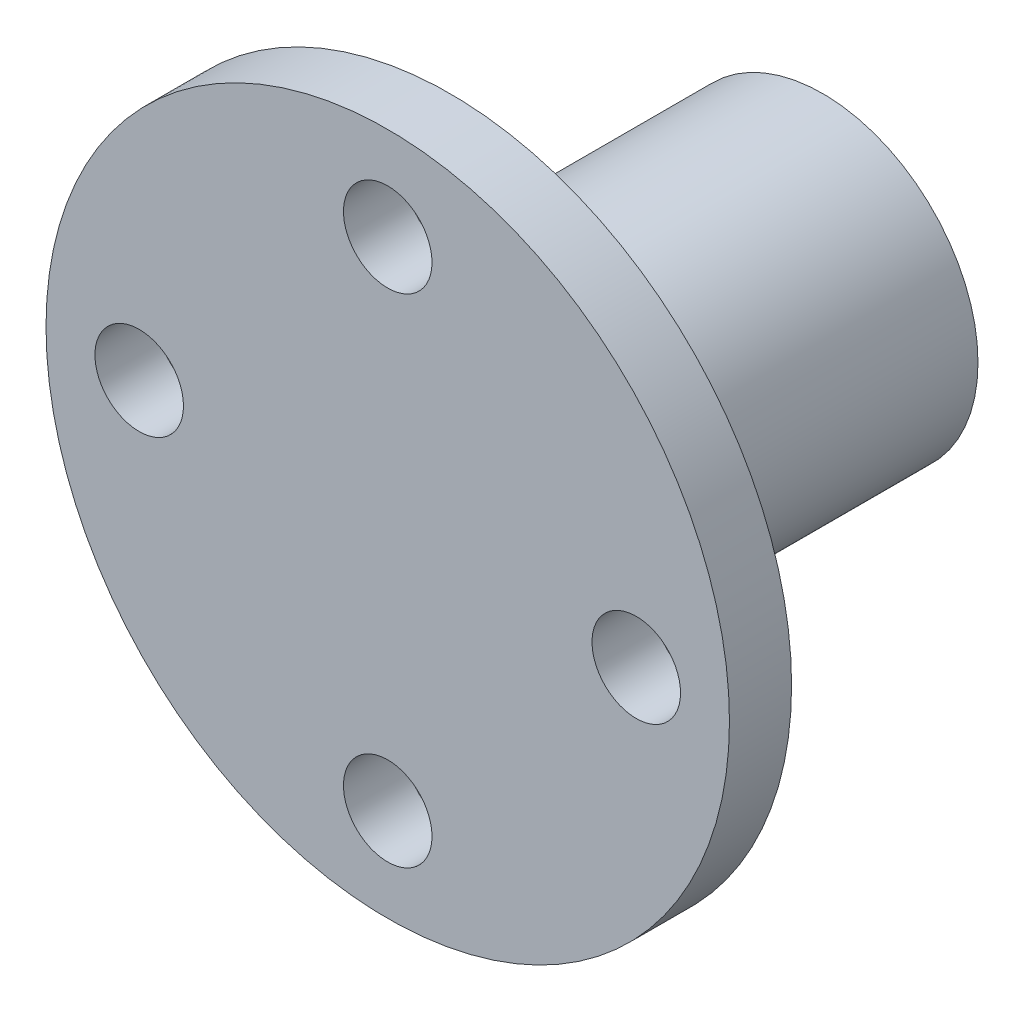
ISO-10303-21;
HEADER;
FILE_DESCRIPTION(('STEP AP214'),'2;1');
FILE_NAME('part.step','',(''),(''),'','','');
FILE_SCHEMA(('AUTOMOTIVE_DESIGN { 1 0 10303 214 1 1 1 1 }'));
ENDSEC;
DATA;
#1=APPLICATION_CONTEXT('core data for automotive mechanical design processes');
#2=APPLICATION_PROTOCOL_DEFINITION('international standard','automotive_design',2000,#1);
#3=PRODUCT_CONTEXT('',#1,'mechanical');
#4=PRODUCT('Part','Part','',(#3));
#5=PRODUCT_RELATED_PRODUCT_CATEGORY('part','',(#4));
#6=PRODUCT_DEFINITION_FORMATION('','',#4);
#7=PRODUCT_DEFINITION_CONTEXT('part definition',#1,'design');
#8=PRODUCT_DEFINITION('design','',#6,#7);
#9=PRODUCT_DEFINITION_SHAPE('','',#8);
#10=(LENGTH_UNIT() NAMED_UNIT(*) SI_UNIT(.MILLI.,.METRE.));
#11=(NAMED_UNIT(*) PLANE_ANGLE_UNIT() SI_UNIT($,.RADIAN.));
#12=(NAMED_UNIT(*) SI_UNIT($,.STERADIAN.) SOLID_ANGLE_UNIT());
#13=UNCERTAINTY_MEASURE_WITH_UNIT(LENGTH_MEASURE(1.E-05),#10,'distance_accuracy_value','');
#14=(GEOMETRIC_REPRESENTATION_CONTEXT(3) GLOBAL_UNCERTAINTY_ASSIGNED_CONTEXT((#13)) GLOBAL_UNIT_ASSIGNED_CONTEXT((#10,
#11,#12)) REPRESENTATION_CONTEXT('',''));
#15=CARTESIAN_POINT('',(0.,0.,0.));
#16=DIRECTION('',(0.,0.,1.));
#17=DIRECTION('',(1.,0.,0.));
#18=AXIS2_PLACEMENT_3D('',#15,#16,#17);
#19=CARTESIAN_POINT('',(0.,0.,2.));
#20=DIRECTION('',(0.,0.,-1.));
#21=DIRECTION('',(-1.,0.,0.));
#22=AXIS2_PLACEMENT_3D('',#19,#20,#21);
#23=CYLINDRICAL_SURFACE('',#22,11.);
#24=CARTESIAN_POINT('',(0.,0.,2.));
#25=DIRECTION('',(0.,0.,1.));
#26=DIRECTION('',(1.,0.,0.));
#27=AXIS2_PLACEMENT_3D('',#24,#25,#26);
#28=CIRCLE('',#27,11.);
#29=CARTESIAN_POINT('',(11.,0.,2.));
#30=VERTEX_POINT('',#29);
#31=EDGE_CURVE('E59',#30,#30,#28,.T.);
#32=ORIENTED_EDGE('',*,*,#31,.F.);
#33=EDGE_LOOP('',(#32));
#34=FACE_BOUND('',#33,.T.);
#35=CARTESIAN_POINT('',(0.,0.,0.));
#36=DIRECTION('',(0.,0.,1.));
#37=DIRECTION('',(1.,0.,0.));
#38=AXIS2_PLACEMENT_3D('',#35,#36,#37);
#39=CIRCLE('',#38,11.);
#40=CARTESIAN_POINT('',(11.,0.,0.));
#41=VERTEX_POINT('',#40);
#42=EDGE_CURVE('E90',#41,#41,#39,.T.);
#43=ORIENTED_EDGE('',*,*,#42,.T.);
#44=EDGE_LOOP('',(#43));
#45=FACE_BOUND('',#44,.T.);
#46=ADVANCED_FACE('F51',(#34,#45),#23,.T.);
#47=CARTESIAN_POINT('',(8.,0.,2.));
#48=DIRECTION('',(0.,0.,-1.));
#49=DIRECTION('',(-1.,0.,0.));
#50=AXIS2_PLACEMENT_3D('',#47,#48,#49);
#51=CYLINDRICAL_SURFACE('',#50,1.425);
#52=CARTESIAN_POINT('',(8.,0.,2.));
#53=DIRECTION('',(0.,0.,1.));
#54=DIRECTION('',(1.,0.,0.));
#55=AXIS2_PLACEMENT_3D('',#52,#53,#54);
#56=CIRCLE('',#55,1.425);
#57=CARTESIAN_POINT('',(9.425,0.,2.));
#58=VERTEX_POINT('',#57);
#59=EDGE_CURVE('E64',#58,#58,#56,.T.);
#60=ORIENTED_EDGE('',*,*,#59,.T.);
#61=EDGE_LOOP('',(#60));
#62=FACE_BOUND('',#61,.T.);
#63=CARTESIAN_POINT('',(8.,0.,0.));
#64=DIRECTION('',(0.,0.,1.));
#65=DIRECTION('',(1.,0.,0.));
#66=AXIS2_PLACEMENT_3D('',#63,#64,#65);
#67=CIRCLE('',#66,1.425);
#68=CARTESIAN_POINT('',(9.425,0.,0.));
#69=VERTEX_POINT('',#68);
#70=EDGE_CURVE('E87',#69,#69,#67,.T.);
#71=ORIENTED_EDGE('',*,*,#70,.F.);
#72=EDGE_LOOP('',(#71));
#73=FACE_BOUND('',#72,.T.);
#74=ADVANCED_FACE('F124',(#62,#73),#51,.F.);
#75=CARTESIAN_POINT('',(0.,-8.,2.));
#76=DIRECTION('',(0.,0.,-1.));
#77=DIRECTION('',(-1.,0.,0.));
#78=AXIS2_PLACEMENT_3D('',#75,#76,#77);
#79=CYLINDRICAL_SURFACE('',#78,1.425);
#80=CARTESIAN_POINT('',(0.,-8.,2.));
#81=DIRECTION('',(0.,0.,1.));
#82=DIRECTION('',(1.,0.,0.));
#83=AXIS2_PLACEMENT_3D('',#80,#81,#82);
#84=CIRCLE('',#83,1.425);
#85=CARTESIAN_POINT('',(1.42499999999994,-8.,2.));
#86=VERTEX_POINT('',#85);
#87=EDGE_CURVE('E70',#86,#86,#84,.T.);
#88=ORIENTED_EDGE('',*,*,#87,.T.);
#89=EDGE_LOOP('',(#88));
#90=FACE_BOUND('',#89,.T.);
#91=CARTESIAN_POINT('',(0.,-8.,0.));
#92=DIRECTION('',(0.,0.,1.));
#93=DIRECTION('',(1.,0.,0.));
#94=AXIS2_PLACEMENT_3D('',#91,#92,#93);
#95=CIRCLE('',#94,1.425);
#96=CARTESIAN_POINT('',(1.42499999999994,-8.,0.));
#97=VERTEX_POINT('',#96);
#98=EDGE_CURVE('E83',#97,#97,#95,.T.);
#99=ORIENTED_EDGE('',*,*,#98,.F.);
#100=EDGE_LOOP('',(#99));
#101=FACE_BOUND('',#100,.T.);
#102=ADVANCED_FACE('F112',(#90,#101),#79,.F.);
#103=CARTESIAN_POINT('',(-8.,0.,2.));
#104=DIRECTION('',(0.,0.,-1.));
#105=DIRECTION('',(-1.,0.,0.));
#106=AXIS2_PLACEMENT_3D('',#103,#104,#105);
#107=CYLINDRICAL_SURFACE('',#106,1.425);
#108=CARTESIAN_POINT('',(-8.,0.,2.));
#109=DIRECTION('',(0.,0.,1.));
#110=DIRECTION('',(1.,0.,0.));
#111=AXIS2_PLACEMENT_3D('',#108,#109,#110);
#112=CIRCLE('',#111,1.425);
#113=CARTESIAN_POINT('',(-6.575,0.,2.));
#114=VERTEX_POINT('',#113);
#115=EDGE_CURVE('E98',#114,#114,#112,.T.);
#116=ORIENTED_EDGE('',*,*,#115,.T.);
#117=EDGE_LOOP('',(#116));
#118=FACE_BOUND('',#117,.T.);
#119=CARTESIAN_POINT('',(-8.,0.,0.));
#120=DIRECTION('',(0.,0.,1.));
#121=DIRECTION('',(1.,0.,0.));
#122=AXIS2_PLACEMENT_3D('',#119,#120,#121);
#123=CIRCLE('',#122,1.425);
#124=CARTESIAN_POINT('',(-6.575,0.,0.));
#125=VERTEX_POINT('',#124);
#126=EDGE_CURVE('E78',#125,#125,#123,.T.);
#127=ORIENTED_EDGE('',*,*,#126,.F.);
#128=EDGE_LOOP('',(#127));
#129=FACE_BOUND('',#128,.T.);
#130=ADVANCED_FACE('F139',(#118,#129),#107,.F.);
#131=CARTESIAN_POINT('',(0.,8.,2.));
#132=DIRECTION('',(0.,0.,-1.));
#133=DIRECTION('',(-1.,0.,0.));
#134=AXIS2_PLACEMENT_3D('',#131,#132,#133);
#135=CYLINDRICAL_SURFACE('',#134,1.425);
#136=CARTESIAN_POINT('',(0.,8.,2.));
#137=DIRECTION('',(0.,0.,1.));
#138=DIRECTION('',(1.,0.,0.));
#139=AXIS2_PLACEMENT_3D('',#136,#137,#138);
#140=CIRCLE('',#139,1.425);
#141=CARTESIAN_POINT('',(1.425,8.,2.));
#142=VERTEX_POINT('',#141);
#143=EDGE_CURVE('E93',#142,#142,#140,.T.);
#144=ORIENTED_EDGE('',*,*,#143,.T.);
#145=EDGE_LOOP('',(#144));
#146=FACE_BOUND('',#145,.T.);
#147=CARTESIAN_POINT('',(0.,8.,0.));
#148=DIRECTION('',(0.,0.,1.));
#149=DIRECTION('',(1.,0.,0.));
#150=AXIS2_PLACEMENT_3D('',#147,#148,#149);
#151=CIRCLE('',#150,1.425);
#152=CARTESIAN_POINT('',(1.425,8.,0.));
#153=VERTEX_POINT('',#152);
#154=EDGE_CURVE('E74',#153,#153,#151,.T.);
#155=ORIENTED_EDGE('',*,*,#154,.F.);
#156=EDGE_LOOP('',(#155));
#157=FACE_BOUND('',#156,.T.);
#158=ADVANCED_FACE('F53',(#146,#157),#135,.F.);
#159=CARTESIAN_POINT('',(0.,0.,0.));
#160=DIRECTION('',(0.,0.,1.));
#161=DIRECTION('',(1.,0.,0.));
#162=AXIS2_PLACEMENT_3D('',#159,#160,#161);
#163=PLANE('',#162);
#164=CARTESIAN_POINT('',(0.,0.,0.));
#165=DIRECTION('',(0.,0.,1.));
#166=DIRECTION('',(1.,0.,0.));
#167=AXIS2_PLACEMENT_3D('',#164,#165,#166);
#168=CIRCLE('',#167,5.);
#169=CARTESIAN_POINT('',(5.,0.,0.));
#170=VERTEX_POINT('',#169);
#171=EDGE_CURVE('E106',#170,#170,#168,.T.);
#172=ORIENTED_EDGE('',*,*,#171,.T.);
#173=EDGE_LOOP('',(#172));
#174=FACE_BOUND('',#173,.T.);
#175=ORIENTED_EDGE('',*,*,#154,.T.);
#176=EDGE_LOOP('',(#175));
#177=FACE_BOUND('',#176,.T.);
#178=ORIENTED_EDGE('',*,*,#126,.T.);
#179=EDGE_LOOP('',(#178));
#180=FACE_BOUND('',#179,.T.);
#181=ORIENTED_EDGE('',*,*,#98,.T.);
#182=EDGE_LOOP('',(#181));
#183=FACE_BOUND('',#182,.T.);
#184=ORIENTED_EDGE('',*,*,#70,.T.);
#185=EDGE_LOOP('',(#184));
#186=FACE_BOUND('',#185,.T.);
#187=ORIENTED_EDGE('',*,*,#42,.F.);
#188=EDGE_LOOP('',(#187));
#189=FACE_BOUND('',#188,.T.);
#190=ADVANCED_FACE('F119',(#174,#177,#180,#183,#186,#189),#163,.F.);
#191=CARTESIAN_POINT('',(0.,0.,2.));
#192=DIRECTION('',(0.,0.,1.));
#193=DIRECTION('',(1.,0.,0.));
#194=AXIS2_PLACEMENT_3D('',#191,#192,#193);
#195=PLANE('',#194);
#196=ORIENTED_EDGE('',*,*,#143,.F.);
#197=EDGE_LOOP('',(#196));
#198=FACE_BOUND('',#197,.T.);
#199=ORIENTED_EDGE('',*,*,#115,.F.);
#200=EDGE_LOOP('',(#199));
#201=FACE_BOUND('',#200,.T.);
#202=ORIENTED_EDGE('',*,*,#87,.F.);
#203=EDGE_LOOP('',(#202));
#204=FACE_BOUND('',#203,.T.);
#205=ORIENTED_EDGE('',*,*,#59,.F.);
#206=EDGE_LOOP('',(#205));
#207=FACE_BOUND('',#206,.T.);
#208=ORIENTED_EDGE('',*,*,#31,.T.);
#209=EDGE_LOOP('',(#208));
#210=FACE_BOUND('',#209,.T.);
#211=ADVANCED_FACE('F115',(#198,#201,#204,#207,#210),#195,.T.);
#212=CARTESIAN_POINT('',(0.,0.,-12.));
#213=DIRECTION('',(0.,0.,1.));
#214=DIRECTION('',(1.,0.,0.));
#215=AXIS2_PLACEMENT_3D('',#212,#213,#214);
#216=CYLINDRICAL_SURFACE('',#215,1.5);
#217=CARTESIAN_POINT('',(0.,0.,-12.));
#218=DIRECTION('',(0.,0.,1.));
#219=DIRECTION('',(1.,0.,0.));
#220=AXIS2_PLACEMENT_3D('',#217,#218,#219);
#221=CIRCLE('',#220,1.5);
#222=CARTESIAN_POINT('',(1.5,0.,-12.));
#223=VERTEX_POINT('',#222);
#224=EDGE_CURVE('E218',#223,#223,#221,.T.);
#225=ORIENTED_EDGE('',*,*,#224,.F.);
#226=EDGE_LOOP('',(#225));
#227=FACE_BOUND('',#226,.T.);
#228=CARTESIAN_POINT('',(0.,0.,0.));
#229=DIRECTION('',(0.,0.,1.));
#230=DIRECTION('',(1.,0.,0.));
#231=AXIS2_PLACEMENT_3D('',#228,#229,#230);
#232=CIRCLE('',#231,1.5);
#233=CARTESIAN_POINT('',(1.5,0.,0.));
#234=VERTEX_POINT('',#233);
#235=EDGE_CURVE('E11',#234,#234,#232,.T.);
#236=ORIENTED_EDGE('',*,*,#235,.T.);
#237=EDGE_LOOP('',(#236));
#238=FACE_BOUND('',#237,.T.);
#239=ADVANCED_FACE('F118',(#227,#238),#216,.F.);
#240=CARTESIAN_POINT('',(0.,0.,-12.));
#241=DIRECTION('',(0.,0.,1.));
#242=DIRECTION('',(1.,0.,0.));
#243=AXIS2_PLACEMENT_3D('',#240,#241,#242);
#244=CYLINDRICAL_SURFACE('',#243,5.);
#245=CARTESIAN_POINT('',(0.,0.,-12.));
#246=DIRECTION('',(0.,0.,1.));
#247=DIRECTION('',(1.,0.,0.));
#248=AXIS2_PLACEMENT_3D('',#245,#246,#247);
#249=CIRCLE('',#248,5.);
#250=CARTESIAN_POINT('',(5.,0.,-12.));
#251=VERTEX_POINT('',#250);
#252=EDGE_CURVE('E79',#251,#251,#249,.T.);
#253=ORIENTED_EDGE('',*,*,#252,.T.);
#254=EDGE_LOOP('',(#253));
#255=FACE_BOUND('',#254,.T.);
#256=ORIENTED_EDGE('',*,*,#171,.F.);
#257=EDGE_LOOP('',(#256));
#258=FACE_BOUND('',#257,.T.);
#259=ADVANCED_FACE('F194',(#255,#258),#244,.T.);
#260=CARTESIAN_POINT('',(0.,0.,-12.));
#261=DIRECTION('',(0.,0.,1.));
#262=DIRECTION('',(1.,0.,0.));
#263=AXIS2_PLACEMENT_3D('',#260,#261,#262);
#264=PLANE('',#263);
#265=ORIENTED_EDGE('',*,*,#224,.T.);
#266=EDGE_LOOP('',(#265));
#267=FACE_BOUND('',#266,.T.);
#268=ORIENTED_EDGE('',*,*,#252,.F.);
#269=EDGE_LOOP('',(#268));
#270=FACE_BOUND('',#269,.T.);
#271=ADVANCED_FACE('F144',(#267,#270),#264,.F.);
#272=ORIENTED_EDGE('',*,*,#235,.F.);
#273=EDGE_LOOP('',(#272));
#274=FACE_BOUND('',#273,.T.);
#275=ADVANCED_FACE('F134',(#274),#163,.F.);
#276=CLOSED_SHELL('',(#46,#74,#102,#130,#158,#190,#211,#239,#259,#271,#275));
#277=MANIFOLD_SOLID_BREP('B2',#276);
#278=ADVANCED_BREP_SHAPE_REPRESENTATION('',(#18,#277),#14);
#279=SHAPE_DEFINITION_REPRESENTATION(#9,#278);
ENDSEC;
END-ISO-10303-21;
